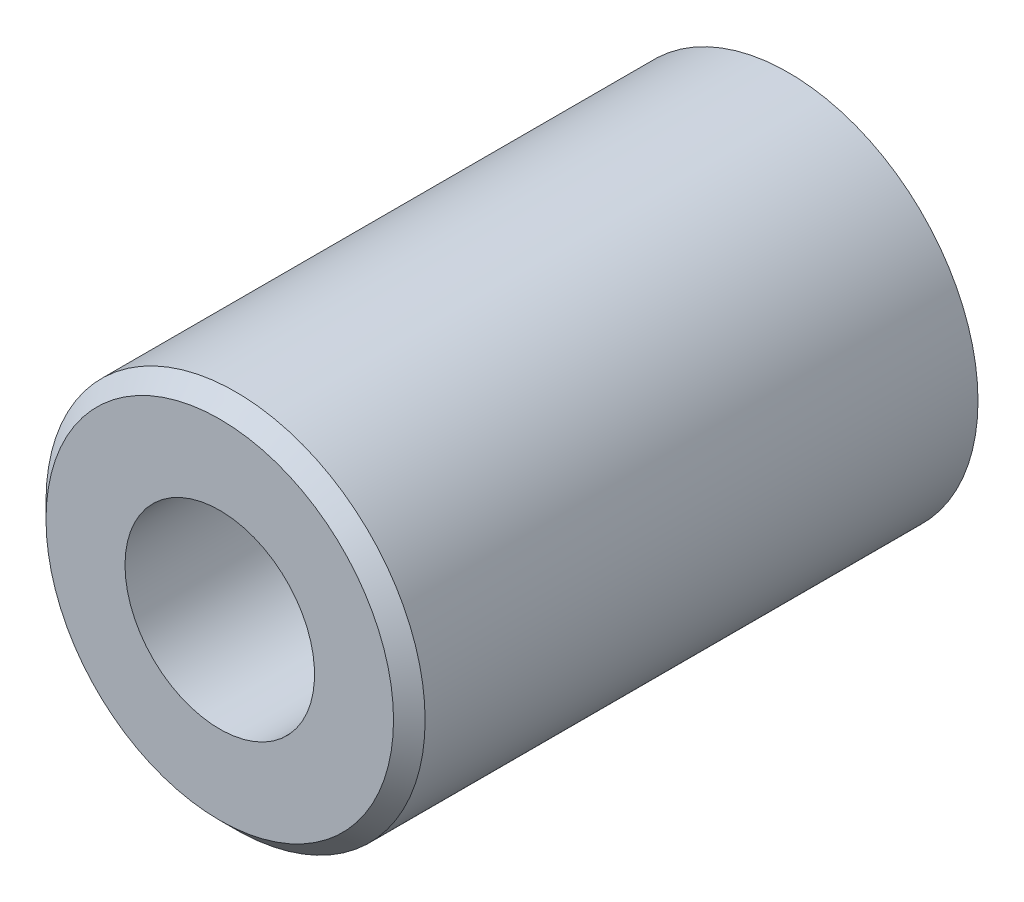
ISO-10303-21;
HEADER;
FILE_DESCRIPTION(('STEP AP214'),'2;1');
FILE_NAME('part.step','',(''),(''),'','','');
FILE_SCHEMA(('AUTOMOTIVE_DESIGN { 1 0 10303 214 1 1 1 1 }'));
ENDSEC;
DATA;
#1=APPLICATION_CONTEXT('core data for automotive mechanical design processes');
#2=APPLICATION_PROTOCOL_DEFINITION('international standard','automotive_design',2000,#1);
#3=PRODUCT_CONTEXT('',#1,'mechanical');
#4=PRODUCT('Part','Part','',(#3));
#5=PRODUCT_RELATED_PRODUCT_CATEGORY('part','',(#4));
#6=PRODUCT_DEFINITION_FORMATION('','',#4);
#7=PRODUCT_DEFINITION_CONTEXT('part definition',#1,'design');
#8=PRODUCT_DEFINITION('design','',#6,#7);
#9=PRODUCT_DEFINITION_SHAPE('','',#8);
#10=(LENGTH_UNIT() NAMED_UNIT(*) SI_UNIT(.MILLI.,.METRE.));
#11=(NAMED_UNIT(*) PLANE_ANGLE_UNIT() SI_UNIT($,.RADIAN.));
#12=(NAMED_UNIT(*) SI_UNIT($,.STERADIAN.) SOLID_ANGLE_UNIT());
#13=UNCERTAINTY_MEASURE_WITH_UNIT(LENGTH_MEASURE(1.E-05),#10,'distance_accuracy_value','');
#14=(GEOMETRIC_REPRESENTATION_CONTEXT(3) GLOBAL_UNCERTAINTY_ASSIGNED_CONTEXT((#13)) GLOBAL_UNIT_ASSIGNED_CONTEXT((#10,
#11,#12)) REPRESENTATION_CONTEXT('',''));
#15=CARTESIAN_POINT('',(0.,0.,0.));
#16=DIRECTION('',(0.,0.,1.));
#17=DIRECTION('',(1.,0.,0.));
#18=AXIS2_PLACEMENT_3D('',#15,#16,#17);
#19=CARTESIAN_POINT('',(0.,0.,4.7625));
#20=DIRECTION('',(0.,0.,1.));
#21=DIRECTION('',(1.,0.,0.));
#22=AXIS2_PLACEMENT_3D('',#19,#20,#21);
#23=PLANE('',#22);
#24=CARTESIAN_POINT('',(0.,0.,4.7625));
#25=DIRECTION('',(0.,0.,1.));
#26=DIRECTION('',(1.,0.,0.));
#27=AXIS2_PLACEMENT_3D('',#24,#25,#26);
#28=CIRCLE('',#27,2.91041666666667);
#29=CARTESIAN_POINT('',(2.91041666666667,0.,4.7625));
#30=VERTEX_POINT('',#29);
#31=EDGE_CURVE('E41',#30,#30,#28,.T.);
#32=ORIENTED_EDGE('',*,*,#31,.T.);
#33=EDGE_LOOP('',(#32));
#34=FACE_BOUND('',#33,.T.);
#35=CARTESIAN_POINT('',(0.,0.,4.7625));
#36=DIRECTION('',(0.,0.,1.));
#37=DIRECTION('',(1.,0.,0.));
#38=AXIS2_PLACEMENT_3D('',#35,#36,#37);
#39=CIRCLE('',#38,1.5875);
#40=CARTESIAN_POINT('',(-1.5875,0.,4.7625));
#41=VERTEX_POINT('',#40);
#42=EDGE_CURVE('E49',#41,#41,#39,.T.);
#43=ORIENTED_EDGE('',*,*,#42,.F.);
#44=EDGE_LOOP('',(#43));
#45=FACE_BOUND('',#44,.T.);
#46=ADVANCED_FACE('F34',(#34,#45),#23,.T.);
#47=CARTESIAN_POINT('',(0.,0.,-4.7625));
#48=DIRECTION('',(0.,0.,1.));
#49=DIRECTION('',(1.,0.,0.));
#50=AXIS2_PLACEMENT_3D('',#47,#48,#49);
#51=PLANE('',#50);
#52=CARTESIAN_POINT('',(0.,0.,-4.7625));
#53=DIRECTION('',(0.,0.,1.));
#54=DIRECTION('',(1.,0.,0.));
#55=AXIS2_PLACEMENT_3D('',#52,#53,#54);
#56=CIRCLE('',#55,3.175);
#57=CARTESIAN_POINT('',(-3.175,0.,-4.7625));
#58=VERTEX_POINT('',#57);
#59=EDGE_CURVE('E45',#58,#58,#56,.T.);
#60=ORIENTED_EDGE('',*,*,#59,.F.);
#61=EDGE_LOOP('',(#60));
#62=FACE_BOUND('',#61,.T.);
#63=CARTESIAN_POINT('',(0.,0.,-4.7625));
#64=DIRECTION('',(0.,0.,1.));
#65=DIRECTION('',(1.,0.,0.));
#66=AXIS2_PLACEMENT_3D('',#63,#64,#65);
#67=CIRCLE('',#66,1.5875);
#68=CARTESIAN_POINT('',(-1.5875,0.,-4.7625));
#69=VERTEX_POINT('',#68);
#70=EDGE_CURVE('E52',#69,#69,#67,.T.);
#71=ORIENTED_EDGE('',*,*,#70,.T.);
#72=EDGE_LOOP('',(#71));
#73=FACE_BOUND('',#72,.T.);
#74=ADVANCED_FACE('F62',(#62,#73),#51,.F.);
#75=CARTESIAN_POINT('',(0.,0.,4.7625));
#76=DIRECTION('',(0.,0.,-1.));
#77=DIRECTION('',(-1.,0.,0.));
#78=AXIS2_PLACEMENT_3D('',#75,#76,#77);
#79=CYLINDRICAL_SURFACE('',#78,3.175);
#80=CARTESIAN_POINT('',(0.,0.,4.49791666666668));
#81=DIRECTION('',(0.,0.,1.));
#82=DIRECTION('',(1.,0.,0.));
#83=AXIS2_PLACEMENT_3D('',#80,#81,#82);
#84=CIRCLE('',#83,3.175);
#85=CARTESIAN_POINT('',(-3.175,0.,4.49791666666668));
#86=VERTEX_POINT('',#85);
#87=EDGE_CURVE('E10',#86,#86,#84,.F.);
#88=CARTESIAN_POINT('',(-3.175,0.,4.49791666666668));
#89=CARTESIAN_POINT('',(-3.175,0.,4.40145399305556));
#90=CARTESIAN_POINT('',(-3.175,0.,4.30499131944445));
#91=CARTESIAN_POINT('',(-3.175,0.,4.11206597222223));
#92=CARTESIAN_POINT('',(-3.175,0.,4.01560329861112));
#93=CARTESIAN_POINT('',(-3.175,0.,3.8226779513889));
#94=CARTESIAN_POINT('',(-3.175,0.,3.72621527777779));
#95=CARTESIAN_POINT('',(-3.175,0.,3.53328993055556));
#96=CARTESIAN_POINT('',(-3.175,0.,3.43682725694445));
#97=CARTESIAN_POINT('',(-3.175,0.,3.24390190972223));
#98=CARTESIAN_POINT('',(-3.175,0.,3.14743923611112));
#99=CARTESIAN_POINT('',(-3.175,0.,2.9545138888889));
#100=CARTESIAN_POINT('',(-3.175,0.,2.85805121527778));
#101=CARTESIAN_POINT('',(-3.175,0.,2.66512586805556));
#102=CARTESIAN_POINT('',(-3.175,0.,2.56866319444445));
#103=CARTESIAN_POINT('',(-3.175,0.,2.37573784722223));
#104=CARTESIAN_POINT('',(-3.175,0.,2.27927517361112));
#105=CARTESIAN_POINT('',(-3.175,0.,2.08634982638889));
#106=CARTESIAN_POINT('',(-3.175,0.,1.98988715277778));
#107=CARTESIAN_POINT('',(-3.175,0.,1.79696180555556));
#108=CARTESIAN_POINT('',(-3.175,0.,1.70049913194445));
#109=CARTESIAN_POINT('',(-3.175,0.,1.50757378472223));
#110=CARTESIAN_POINT('',(-3.175,0.,1.41111111111112));
#111=CARTESIAN_POINT('',(-3.175,0.,1.21818576388889));
#112=CARTESIAN_POINT('',(-3.175,0.,1.12172309027778));
#113=CARTESIAN_POINT('',(-3.175,0.,0.92879774305556));
#114=CARTESIAN_POINT('',(-3.175,0.,0.832335069444449));
#115=CARTESIAN_POINT('',(-3.175,0.,0.639409722222227));
#116=CARTESIAN_POINT('',(-3.175,0.,0.542947048611115));
#117=CARTESIAN_POINT('',(-3.175,0.,0.350021701388893));
#118=CARTESIAN_POINT('',(-3.175,0.,0.253559027777782));
#119=CARTESIAN_POINT('',(-3.175,0.,0.0606336805555596));
#120=CARTESIAN_POINT('',(-3.175,0.,-0.0358289930555515));
#121=CARTESIAN_POINT('',(-3.175,0.,-0.228754340277774));
#122=CARTESIAN_POINT('',(-3.175,0.,-0.325217013888886));
#123=CARTESIAN_POINT('',(-3.175,0.,-0.518142361111108));
#124=CARTESIAN_POINT('',(-3.175,0.,-0.614605034722219));
#125=CARTESIAN_POINT('',(-3.175,0.,-0.807530381944442));
#126=CARTESIAN_POINT('',(-3.175,0.,-0.903993055555553));
#127=CARTESIAN_POINT('',(-3.175,0.,-1.09691840277777));
#128=CARTESIAN_POINT('',(-3.175,0.,-1.19338107638889));
#129=CARTESIAN_POINT('',(-3.175,0.,-1.38630642361111));
#130=CARTESIAN_POINT('',(-3.175,0.,-1.48276909722222));
#131=CARTESIAN_POINT('',(-3.175,0.,-1.67569444444444));
#132=CARTESIAN_POINT('',(-3.175,0.,-1.77215711805555));
#133=CARTESIAN_POINT('',(-3.175,0.,-1.96508246527778));
#134=CARTESIAN_POINT('',(-3.175,0.,-2.06154513888889));
#135=CARTESIAN_POINT('',(-3.175,0.,-2.25447048611111));
#136=CARTESIAN_POINT('',(-3.175,0.,-2.35093315972222));
#137=CARTESIAN_POINT('',(-3.175,0.,-2.54385850694444));
#138=CARTESIAN_POINT('',(-3.175,0.,-2.64032118055555));
#139=CARTESIAN_POINT('',(-3.175,0.,-2.83324652777778));
#140=CARTESIAN_POINT('',(-3.175,0.,-2.92970920138889));
#141=CARTESIAN_POINT('',(-3.175,0.,-3.12263454861111));
#142=CARTESIAN_POINT('',(-3.175,0.,-3.21909722222222));
#143=CARTESIAN_POINT('',(-3.175,0.,-3.41202256944444));
#144=CARTESIAN_POINT('',(-3.175,0.,-3.50848524305555));
#145=CARTESIAN_POINT('',(-3.175,0.,-3.70141059027778));
#146=CARTESIAN_POINT('',(-3.175,0.,-3.79787326388889));
#147=CARTESIAN_POINT('',(-3.175,0.,-3.99079861111111));
#148=CARTESIAN_POINT('',(-3.175,0.,-4.08726128472222));
#149=CARTESIAN_POINT('',(-3.175,0.,-4.28018663194444));
#150=CARTESIAN_POINT('',(-3.175,0.,-4.37664930555556));
#151=CARTESIAN_POINT('',(-3.175,0.,-4.56957465277778));
#152=CARTESIAN_POINT('',(-3.175,0.,-4.66603732638889));
#153=CARTESIAN_POINT('',(-3.175,0.,-4.7625));
#154=B_SPLINE_CURVE_WITH_KNOTS('',3,(#88,#89,#90,#91,#92,#93,#94,#95,#96,#97,#98,#99,#100,#101,
#102,#103,#104,#105,#106,#107,#108,#109,#110,#111,#112,#113,#114,#115,#116,#117,#118,#119,#120,
#121,#122,#123,#124,#125,#126,#127,#128,#129,#130,#131,#132,#133,#134,#135,#136,#137,#138,#139,
#140,#141,#142,#143,#144,#145,#146,#147,#148,#149,#150,#151,#152,#153),.UNSPECIFIED.,.F.,.F.,(4,
2,2,2,2,2,2,2,2,2,2,2,2,2,2,2,2,2,2,2,2,2,2,2,2,2,2,2,2,2,2,2,4),(0.,0.289388020833334,
0.578776041666668,0.868164062500001,1.15755208333334,1.44694010416667,1.736328125,
2.02571614583334,2.31510416666667,2.6044921875,2.89388020833334,3.18326822916667,3.47265625,
3.76204427083334,4.05143229166667,4.3408203125,4.63020833333334,4.91959635416667,
5.20898437500001,5.49837239583334,5.78776041666667,6.07714843750001,6.36653645833334,
6.65592447916667,6.94531250000001,7.23470052083334,7.52408854166667,7.81347656250001,
8.10286458333334,8.39225260416667,8.68164062500001,8.97102864583334,9.26041666666667),.UNSPECIFIED.);
#155=EDGE_CURVE('BSEAM67',#86,#58,#154,.T.);
#156=ORIENTED_EDGE('',*,*,#87,.T.);
#157=ORIENTED_EDGE('',*,*,#59,.T.);
#158=ORIENTED_EDGE('',*,*,#155,.T.);
#159=ORIENTED_EDGE('',*,*,#155,.F.);
#160=EDGE_LOOP('',(#156,#158,#157,#159));
#161=FACE_BOUND('',#160,.T.);
#162=ADVANCED_FACE('F67',(#161),#79,.T.);
#163=CARTESIAN_POINT('',(0.,0.,4.7625));
#164=DIRECTION('',(0.,0.,-1.));
#165=DIRECTION('',(-1.,0.,0.));
#166=AXIS2_PLACEMENT_3D('',#163,#164,#165);
#167=CYLINDRICAL_SURFACE('',#166,1.5875);
#168=CARTESIAN_POINT('',(-1.5875,0.,4.7625));
#169=CARTESIAN_POINT('',(-1.5875,0.,4.66328125));
#170=CARTESIAN_POINT('',(-1.5875,0.,4.5640625));
#171=CARTESIAN_POINT('',(-1.5875,0.,4.365625));
#172=CARTESIAN_POINT('',(-1.5875,0.,4.26640625));
#173=CARTESIAN_POINT('',(-1.5875,0.,4.06796875));
#174=CARTESIAN_POINT('',(-1.5875,0.,3.96875));
#175=CARTESIAN_POINT('',(-1.5875,0.,3.7703125));
#176=CARTESIAN_POINT('',(-1.5875,0.,3.67109375));
#177=CARTESIAN_POINT('',(-1.5875,0.,3.47265625));
#178=CARTESIAN_POINT('',(-1.5875,0.,3.3734375));
#179=CARTESIAN_POINT('',(-1.5875,0.,3.175));
#180=CARTESIAN_POINT('',(-1.5875,0.,3.07578125));
#181=CARTESIAN_POINT('',(-1.5875,0.,2.87734375));
#182=CARTESIAN_POINT('',(-1.5875,0.,2.778125));
#183=CARTESIAN_POINT('',(-1.5875,0.,2.5796875));
#184=CARTESIAN_POINT('',(-1.5875,0.,2.48046875));
#185=CARTESIAN_POINT('',(-1.5875,0.,2.28203125));
#186=CARTESIAN_POINT('',(-1.5875,0.,2.1828125));
#187=CARTESIAN_POINT('',(-1.5875,0.,1.984375));
#188=CARTESIAN_POINT('',(-1.5875,0.,1.88515625));
#189=CARTESIAN_POINT('',(-1.5875,0.,1.68671875));
#190=CARTESIAN_POINT('',(-1.5875,0.,1.5875));
#191=CARTESIAN_POINT('',(-1.5875,0.,1.3890625));
#192=CARTESIAN_POINT('',(-1.5875,0.,1.28984375));
#193=CARTESIAN_POINT('',(-1.5875,0.,1.09140625));
#194=CARTESIAN_POINT('',(-1.5875,0.,0.992187499999999));
#195=CARTESIAN_POINT('',(-1.5875,0.,0.793749999999999));
#196=CARTESIAN_POINT('',(-1.5875,0.,0.694531249999999));
#197=CARTESIAN_POINT('',(-1.5875,0.,0.496093749999999));
#198=CARTESIAN_POINT('',(-1.5875,0.,0.396874999999999));
#199=CARTESIAN_POINT('',(-1.5875,0.,0.198437499999999));
#200=CARTESIAN_POINT('',(-1.5875,0.,0.0992187499999992));
#201=CARTESIAN_POINT('',(-1.5875,0.,-0.0992187500000009));
#202=CARTESIAN_POINT('',(-1.5875,0.,-0.198437500000001));
#203=CARTESIAN_POINT('',(-1.5875,0.,-0.396875000000001));
#204=CARTESIAN_POINT('',(-1.5875,0.,-0.496093750000001));
#205=CARTESIAN_POINT('',(-1.5875,0.,-0.694531250000001));
#206=CARTESIAN_POINT('',(-1.5875,0.,-0.793750000000001));
#207=CARTESIAN_POINT('',(-1.5875,0.,-0.992187500000002));
#208=CARTESIAN_POINT('',(-1.5875,0.,-1.09140625));
#209=CARTESIAN_POINT('',(-1.5875,0.,-1.28984375));
#210=CARTESIAN_POINT('',(-1.5875,0.,-1.3890625));
#211=CARTESIAN_POINT('',(-1.5875,0.,-1.5875));
#212=CARTESIAN_POINT('',(-1.5875,0.,-1.68671875));
#213=CARTESIAN_POINT('',(-1.5875,0.,-1.88515625));
#214=CARTESIAN_POINT('',(-1.5875,0.,-1.984375));
#215=CARTESIAN_POINT('',(-1.5875,0.,-2.1828125));
#216=CARTESIAN_POINT('',(-1.5875,0.,-2.28203125));
#217=CARTESIAN_POINT('',(-1.5875,0.,-2.48046875));
#218=CARTESIAN_POINT('',(-1.5875,0.,-2.5796875));
#219=CARTESIAN_POINT('',(-1.5875,0.,-2.778125));
#220=CARTESIAN_POINT('',(-1.5875,0.,-2.87734375));
#221=CARTESIAN_POINT('',(-1.5875,0.,-3.07578125));
#222=CARTESIAN_POINT('',(-1.5875,0.,-3.175));
#223=CARTESIAN_POINT('',(-1.5875,0.,-3.3734375));
#224=CARTESIAN_POINT('',(-1.5875,0.,-3.47265625));
#225=CARTESIAN_POINT('',(-1.5875,0.,-3.67109375));
#226=CARTESIAN_POINT('',(-1.5875,0.,-3.7703125));
#227=CARTESIAN_POINT('',(-1.5875,0.,-3.96875));
#228=CARTESIAN_POINT('',(-1.5875,0.,-4.06796875));
#229=CARTESIAN_POINT('',(-1.5875,0.,-4.26640625));
#230=CARTESIAN_POINT('',(-1.5875,0.,-4.365625));
#231=CARTESIAN_POINT('',(-1.5875,0.,-4.5640625));
#232=CARTESIAN_POINT('',(-1.5875,0.,-4.66328125));
#233=CARTESIAN_POINT('',(-1.5875,0.,-4.7625));
#234=B_SPLINE_CURVE_WITH_KNOTS('',3,(#168,#169,#170,#171,#172,#173,#174,#175,#176,#177,#178,
#179,#180,#181,#182,#183,#184,#185,#186,#187,#188,#189,#190,#191,#192,#193,#194,#195,#196,#197,
#198,#199,#200,#201,#202,#203,#204,#205,#206,#207,#208,#209,#210,#211,#212,#213,#214,#215,#216,
#217,#218,#219,#220,#221,#222,#223,#224,#225,#226,#227,#228,#229,#230,#231,#232,#233),
.UNSPECIFIED.,.F.,.F.,(4,2,2,2,2,2,2,2,2,2,2,2,2,2,2,2,2,2,2,2,2,2,2,2,2,2,2,2,2,2,2,2,4),(0.,
0.297656249999999,0.595312499999999,0.89296875,1.190625,1.48828125,1.7859375,2.08359375,2.38125,
2.67890625,2.9765625,3.27421875,3.571875,3.86953125,4.1671875,4.46484375,4.7625,5.06015625,
5.3578125,5.65546875,5.953125,6.25078125,6.5484375,6.84609375,7.14375,7.44140625,7.7390625,
8.03671875,8.334375,8.63203125,8.9296875,9.22734375,9.525),.UNSPECIFIED.);
#235=EDGE_CURVE('BSEAM58',#41,#69,#234,.T.);
#236=ORIENTED_EDGE('',*,*,#42,.T.);
#237=ORIENTED_EDGE('',*,*,#70,.F.);
#238=ORIENTED_EDGE('',*,*,#235,.T.);
#239=ORIENTED_EDGE('',*,*,#235,.F.);
#240=EDGE_LOOP('',(#236,#238,#237,#239));
#241=FACE_BOUND('',#240,.T.);
#242=ADVANCED_FACE('F58',(#241),#167,.F.);
#243=CARTESIAN_POINT('',(0.,0.,4.7625));
#244=DIRECTION('',(0.,0.,-1.));
#245=DIRECTION('',(-1.,0.,0.));
#246=AXIS2_PLACEMENT_3D('',#243,#244,#245);
#247=CONICAL_SURFACE('',#246,2.91041666666667,0.785398163397446);
#248=ORIENTED_EDGE('',*,*,#87,.F.);
#249=EDGE_LOOP('',(#248));
#250=FACE_BOUND('',#249,.T.);
#251=ORIENTED_EDGE('',*,*,#31,.F.);
#252=EDGE_LOOP('',(#251));
#253=FACE_BOUND('',#252,.T.);
#254=ADVANCED_FACE('F36',(#250,#253),#247,.T.);
#255=CLOSED_SHELL('',(#46,#74,#162,#242,#254));
#256=MANIFOLD_SOLID_BREP('B2',#255);
#257=ADVANCED_BREP_SHAPE_REPRESENTATION('',(#18,#256),#14);
#258=SHAPE_DEFINITION_REPRESENTATION(#9,#257);
ENDSEC;
END-ISO-10303-21;
